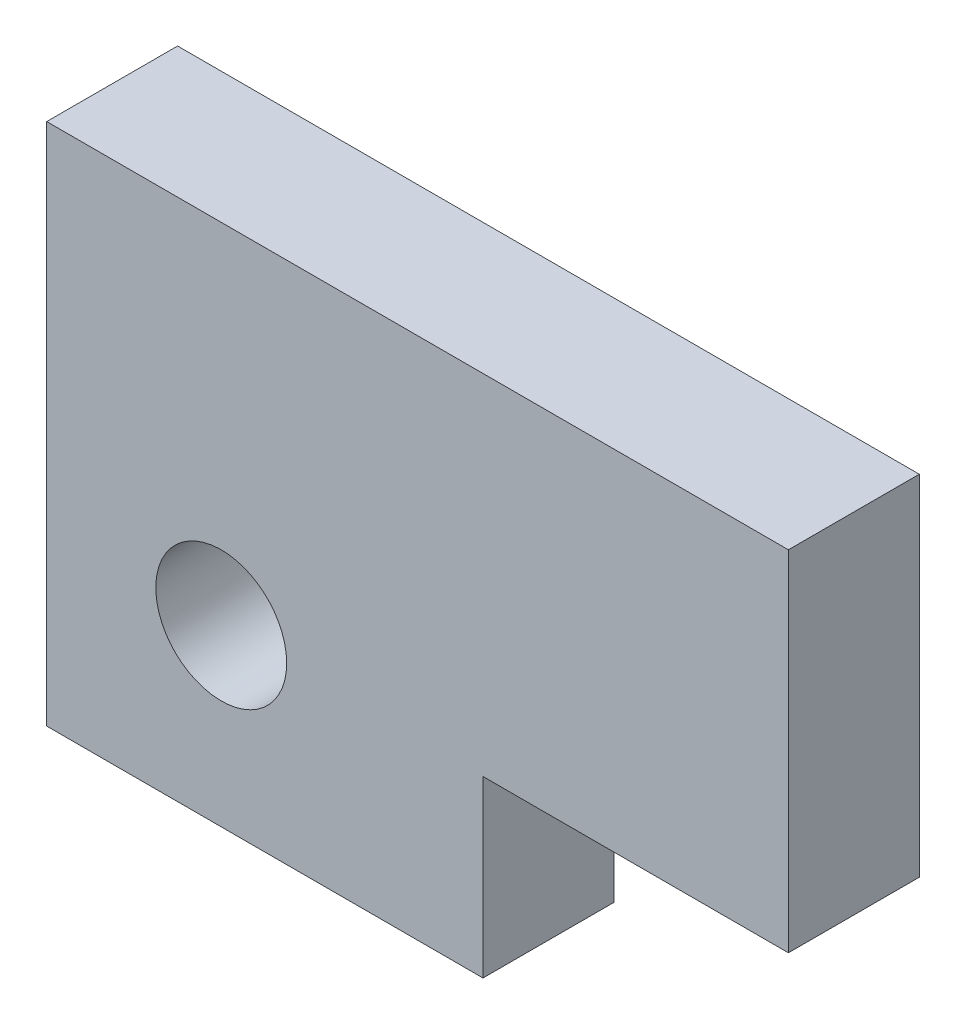
ISO-10303-21;
HEADER;
FILE_DESCRIPTION(('STEP AP214'),'2;1');
FILE_NAME('part.step','',(''),(''),'','','');
FILE_SCHEMA(('AUTOMOTIVE_DESIGN { 1 0 10303 214 1 1 1 1 }'));
ENDSEC;
DATA;
#1=APPLICATION_CONTEXT('core data for automotive mechanical design processes');
#2=APPLICATION_PROTOCOL_DEFINITION('international standard','automotive_design',2000,#1);
#3=PRODUCT_CONTEXT('',#1,'mechanical');
#4=PRODUCT('Part','Part','',(#3));
#5=PRODUCT_RELATED_PRODUCT_CATEGORY('part','',(#4));
#6=PRODUCT_DEFINITION_FORMATION('','',#4);
#7=PRODUCT_DEFINITION_CONTEXT('part definition',#1,'design');
#8=PRODUCT_DEFINITION('design','',#6,#7);
#9=PRODUCT_DEFINITION_SHAPE('','',#8);
#10=(LENGTH_UNIT() NAMED_UNIT(*) SI_UNIT(.MILLI.,.METRE.));
#11=(NAMED_UNIT(*) PLANE_ANGLE_UNIT() SI_UNIT($,.RADIAN.));
#12=(NAMED_UNIT(*) SI_UNIT($,.STERADIAN.) SOLID_ANGLE_UNIT());
#13=UNCERTAINTY_MEASURE_WITH_UNIT(LENGTH_MEASURE(1.E-05),#10,'distance_accuracy_value','');
#14=(GEOMETRIC_REPRESENTATION_CONTEXT(3) GLOBAL_UNCERTAINTY_ASSIGNED_CONTEXT((#13)) GLOBAL_UNIT_ASSIGNED_CONTEXT((#10,
#11,#12)) REPRESENTATION_CONTEXT('',''));
#15=CARTESIAN_POINT('',(0.,0.,0.));
#16=DIRECTION('',(0.,0.,1.));
#17=DIRECTION('',(1.,0.,0.));
#18=AXIS2_PLACEMENT_3D('',#15,#16,#17);
#19=CARTESIAN_POINT('',(0.,0.,3.));
#20=DIRECTION('',(1.,0.,0.));
#21=DIRECTION('',(0.,1.,0.));
#22=AXIS2_PLACEMENT_3D('',#19,#20,#21);
#23=PLANE('',#22);
#24=DIRECTION('',(0.,-1.,0.));
#25=VECTOR('',#24,1.);
#26=CARTESIAN_POINT('',(0.,0.,0.));
#27=LINE('',#26,#25);
#28=CARTESIAN_POINT('',(0.,12.,0.));
#29=VERTEX_POINT('',#28);
#30=CARTESIAN_POINT('',(0.,0.,0.));
#31=VERTEX_POINT('',#30);
#32=EDGE_CURVE('E119',#29,#31,#27,.T.);
#33=ORIENTED_EDGE('',*,*,#32,.T.);
#34=DIRECTION('',(0.,0.,-1.));
#35=VECTOR('',#34,1.);
#36=CARTESIAN_POINT('',(0.,0.,3.));
#37=LINE('',#36,#35);
#38=CARTESIAN_POINT('',(0.,0.,3.));
#39=VERTEX_POINT('',#38);
#40=EDGE_CURVE('E11',#39,#31,#37,.T.);
#41=ORIENTED_EDGE('',*,*,#40,.F.);
#42=DIRECTION('',(0.,-1.,0.));
#43=VECTOR('',#42,1.);
#44=CARTESIAN_POINT('',(0.,0.,3.));
#45=LINE('',#44,#43);
#46=CARTESIAN_POINT('',(0.,12.,3.));
#47=VERTEX_POINT('',#46);
#48=EDGE_CURVE('E130',#47,#39,#45,.T.);
#49=ORIENTED_EDGE('',*,*,#48,.F.);
#50=DIRECTION('',(0.,0.,-1.));
#51=VECTOR('',#50,1.);
#52=CARTESIAN_POINT('',(0.,12.,3.));
#53=LINE('',#52,#51);
#54=EDGE_CURVE('E115',#47,#29,#53,.T.);
#55=ORIENTED_EDGE('',*,*,#54,.T.);
#56=EDGE_LOOP('',(#33,#41,#49,#55));
#57=FACE_BOUND('',#56,.T.);
#58=ADVANCED_FACE('F35',(#57),#23,.F.);
#59=CARTESIAN_POINT('',(0.,0.,3.));
#60=DIRECTION('',(0.,1.,0.));
#61=DIRECTION('',(0.,0.,1.));
#62=AXIS2_PLACEMENT_3D('',#59,#60,#61);
#63=PLANE('',#62);
#64=DIRECTION('',(1.,0.,0.));
#65=VECTOR('',#64,1.);
#66=CARTESIAN_POINT('',(0.,0.,0.));
#67=LINE('',#66,#65);
#68=CARTESIAN_POINT('',(10.,0.,0.));
#69=VERTEX_POINT('',#68);
#70=EDGE_CURVE('E122',#31,#69,#67,.T.);
#71=ORIENTED_EDGE('',*,*,#70,.T.);
#72=DIRECTION('',(0.,0.,-1.));
#73=VECTOR('',#72,1.);
#74=CARTESIAN_POINT('',(10.,0.,3.));
#75=LINE('',#74,#73);
#76=CARTESIAN_POINT('',(10.,0.,3.));
#77=VERTEX_POINT('',#76);
#78=EDGE_CURVE('E43',#77,#69,#75,.T.);
#79=ORIENTED_EDGE('',*,*,#78,.F.);
#80=DIRECTION('',(1.,0.,0.));
#81=VECTOR('',#80,1.);
#82=CARTESIAN_POINT('',(0.,0.,3.));
#83=LINE('',#82,#81);
#84=EDGE_CURVE('E88',#39,#77,#83,.T.);
#85=ORIENTED_EDGE('',*,*,#84,.F.);
#86=ORIENTED_EDGE('',*,*,#40,.T.);
#87=EDGE_LOOP('',(#71,#79,#85,#86));
#88=FACE_BOUND('',#87,.T.);
#89=ADVANCED_FACE('F155',(#88),#63,.F.);
#90=CARTESIAN_POINT('',(10.,4.,3.));
#91=DIRECTION('',(-1.,0.,0.));
#92=DIRECTION('',(0.,-1.,0.));
#93=AXIS2_PLACEMENT_3D('',#90,#91,#92);
#94=PLANE('',#93);
#95=DIRECTION('',(0.,1.,0.));
#96=VECTOR('',#95,1.);
#97=CARTESIAN_POINT('',(10.,4.,0.));
#98=LINE('',#97,#96);
#99=CARTESIAN_POINT('',(10.,4.,0.));
#100=VERTEX_POINT('',#99);
#101=EDGE_CURVE('E125',#69,#100,#98,.T.);
#102=ORIENTED_EDGE('',*,*,#101,.T.);
#103=DIRECTION('',(0.,0.,-1.));
#104=VECTOR('',#103,1.);
#105=CARTESIAN_POINT('',(10.,4.,3.));
#106=LINE('',#105,#104);
#107=CARTESIAN_POINT('',(10.,4.,3.));
#108=VERTEX_POINT('',#107);
#109=EDGE_CURVE('E110',#108,#100,#106,.T.);
#110=ORIENTED_EDGE('',*,*,#109,.F.);
#111=DIRECTION('',(0.,1.,0.));
#112=VECTOR('',#111,1.);
#113=CARTESIAN_POINT('',(10.,4.,3.));
#114=LINE('',#113,#112);
#115=EDGE_CURVE('E101',#77,#108,#114,.T.);
#116=ORIENTED_EDGE('',*,*,#115,.F.);
#117=ORIENTED_EDGE('',*,*,#78,.T.);
#118=EDGE_LOOP('',(#102,#110,#116,#117));
#119=FACE_BOUND('',#118,.T.);
#120=ADVANCED_FACE('F136',(#119),#94,.F.);
#121=CARTESIAN_POINT('',(17.,4.,3.));
#122=DIRECTION('',(0.,1.,0.));
#123=DIRECTION('',(-1.,0.,0.));
#124=AXIS2_PLACEMENT_3D('',#121,#122,#123);
#125=PLANE('',#124);
#126=DIRECTION('',(1.,0.,0.));
#127=VECTOR('',#126,1.);
#128=CARTESIAN_POINT('',(17.,4.,0.));
#129=LINE('',#128,#127);
#130=CARTESIAN_POINT('',(17.,4.,0.));
#131=VERTEX_POINT('',#130);
#132=EDGE_CURVE('E109',#100,#131,#129,.T.);
#133=ORIENTED_EDGE('',*,*,#132,.T.);
#134=DIRECTION('',(0.,0.,-1.));
#135=VECTOR('',#134,1.);
#136=CARTESIAN_POINT('',(17.,4.,3.));
#137=LINE('',#136,#135);
#138=CARTESIAN_POINT('',(17.,4.,3.));
#139=VERTEX_POINT('',#138);
#140=EDGE_CURVE('E106',#139,#131,#137,.T.);
#141=ORIENTED_EDGE('',*,*,#140,.F.);
#142=DIRECTION('',(1.,0.,0.));
#143=VECTOR('',#142,1.);
#144=CARTESIAN_POINT('',(17.,4.,3.));
#145=LINE('',#144,#143);
#146=EDGE_CURVE('E95',#108,#139,#145,.T.);
#147=ORIENTED_EDGE('',*,*,#146,.F.);
#148=ORIENTED_EDGE('',*,*,#109,.T.);
#149=EDGE_LOOP('',(#133,#141,#147,#148));
#150=FACE_BOUND('',#149,.T.);
#151=ADVANCED_FACE('F107',(#150),#125,.F.);
#152=CARTESIAN_POINT('',(17.,4.,3.));
#153=DIRECTION('',(-1.,0.,0.));
#154=DIRECTION('',(0.,0.,1.));
#155=AXIS2_PLACEMENT_3D('',#152,#153,#154);
#156=PLANE('',#155);
#157=DIRECTION('',(0.,1.,0.));
#158=VECTOR('',#157,1.);
#159=CARTESIAN_POINT('',(17.,4.,0.));
#160=LINE('',#159,#158);
#161=CARTESIAN_POINT('',(17.,12.,0.));
#162=VERTEX_POINT('',#161);
#163=EDGE_CURVE('E74',#131,#162,#160,.T.);
#164=ORIENTED_EDGE('',*,*,#163,.T.);
#165=DIRECTION('',(0.,0.,-1.));
#166=VECTOR('',#165,1.);
#167=CARTESIAN_POINT('',(17.,12.,3.));
#168=LINE('',#167,#166);
#169=CARTESIAN_POINT('',(17.,12.,3.));
#170=VERTEX_POINT('',#169);
#171=EDGE_CURVE('E111',#170,#162,#168,.T.);
#172=ORIENTED_EDGE('',*,*,#171,.F.);
#173=DIRECTION('',(0.,1.,0.));
#174=VECTOR('',#173,1.);
#175=CARTESIAN_POINT('',(17.,4.,3.));
#176=LINE('',#175,#174);
#177=EDGE_CURVE('E99',#139,#170,#176,.T.);
#178=ORIENTED_EDGE('',*,*,#177,.F.);
#179=ORIENTED_EDGE('',*,*,#140,.T.);
#180=EDGE_LOOP('',(#164,#172,#178,#179));
#181=FACE_BOUND('',#180,.T.);
#182=ADVANCED_FACE('F113',(#181),#156,.F.);
#183=CARTESIAN_POINT('',(0.,12.,3.));
#184=DIRECTION('',(0.,-1.,0.));
#185=DIRECTION('',(0.,0.,-1.));
#186=AXIS2_PLACEMENT_3D('',#183,#184,#185);
#187=PLANE('',#186);
#188=DIRECTION('',(-1.,0.,0.));
#189=VECTOR('',#188,1.);
#190=CARTESIAN_POINT('',(0.,12.,0.));
#191=LINE('',#190,#189);
#192=EDGE_CURVE('E80',#162,#29,#191,.T.);
#193=ORIENTED_EDGE('',*,*,#192,.T.);
#194=ORIENTED_EDGE('',*,*,#54,.F.);
#195=DIRECTION('',(-1.,0.,0.));
#196=VECTOR('',#195,1.);
#197=CARTESIAN_POINT('',(0.,12.,3.));
#198=LINE('',#197,#196);
#199=EDGE_CURVE('E51',#170,#47,#198,.T.);
#200=ORIENTED_EDGE('',*,*,#199,.F.);
#201=ORIENTED_EDGE('',*,*,#171,.T.);
#202=EDGE_LOOP('',(#193,#194,#200,#201));
#203=FACE_BOUND('',#202,.T.);
#204=ADVANCED_FACE('F143',(#203),#187,.F.);
#205=CARTESIAN_POINT('',(0.,0.,3.));
#206=DIRECTION('',(0.,0.,-1.));
#207=DIRECTION('',(-1.,0.,0.));
#208=AXIS2_PLACEMENT_3D('',#205,#206,#207);
#209=PLANE('',#208);
#210=CARTESIAN_POINT('',(4.,4.,3.));
#211=DIRECTION('',(0.,0.,1.));
#212=DIRECTION('',(1.,0.,0.));
#213=AXIS2_PLACEMENT_3D('',#210,#211,#212);
#214=CIRCLE('',#213,1.5);
#215=CARTESIAN_POINT('',(5.5,4.,3.));
#216=VERTEX_POINT('',#215);
#217=EDGE_CURVE('E210',#216,#216,#214,.T.);
#218=ORIENTED_EDGE('',*,*,#217,.F.);
#219=EDGE_LOOP('',(#218));
#220=FACE_BOUND('',#219,.T.);
#221=ORIENTED_EDGE('',*,*,#48,.T.);
#222=ORIENTED_EDGE('',*,*,#84,.T.);
#223=ORIENTED_EDGE('',*,*,#115,.T.);
#224=ORIENTED_EDGE('',*,*,#146,.T.);
#225=ORIENTED_EDGE('',*,*,#177,.T.);
#226=ORIENTED_EDGE('',*,*,#199,.T.);
#227=EDGE_LOOP('',(#221,#222,#223,#224,#225,#226));
#228=FACE_BOUND('',#227,.T.);
#229=ADVANCED_FACE('F97',(#220,#228),#209,.F.);
#230=CARTESIAN_POINT('',(0.,0.,0.));
#231=DIRECTION('',(0.,0.,-1.));
#232=DIRECTION('',(-1.,0.,0.));
#233=AXIS2_PLACEMENT_3D('',#230,#231,#232);
#234=PLANE('',#233);
#235=CARTESIAN_POINT('',(4.,4.,0.));
#236=DIRECTION('',(0.,0.,1.));
#237=DIRECTION('',(1.,0.,0.));
#238=AXIS2_PLACEMENT_3D('',#235,#236,#237);
#239=CIRCLE('',#238,1.5);
#240=CARTESIAN_POINT('',(5.5,4.,0.));
#241=VERTEX_POINT('',#240);
#242=EDGE_CURVE('E123',#241,#241,#239,.T.);
#243=ORIENTED_EDGE('',*,*,#242,.T.);
#244=EDGE_LOOP('',(#243));
#245=FACE_BOUND('',#244,.T.);
#246=ORIENTED_EDGE('',*,*,#32,.F.);
#247=ORIENTED_EDGE('',*,*,#192,.F.);
#248=ORIENTED_EDGE('',*,*,#163,.F.);
#249=ORIENTED_EDGE('',*,*,#132,.F.);
#250=ORIENTED_EDGE('',*,*,#101,.F.);
#251=ORIENTED_EDGE('',*,*,#70,.F.);
#252=EDGE_LOOP('',(#246,#247,#248,#249,#250,#251));
#253=FACE_BOUND('',#252,.T.);
#254=ADVANCED_FACE('F139',(#245,#253),#234,.T.);
#255=CARTESIAN_POINT('',(4.,4.,0.));
#256=DIRECTION('',(0.,0.,1.));
#257=DIRECTION('',(1.,0.,0.));
#258=AXIS2_PLACEMENT_3D('',#255,#256,#257);
#259=CYLINDRICAL_SURFACE('',#258,1.5);
#260=ORIENTED_EDGE('',*,*,#242,.F.);
#261=EDGE_LOOP('',(#260));
#262=FACE_BOUND('',#261,.T.);
#263=ORIENTED_EDGE('',*,*,#217,.T.);
#264=EDGE_LOOP('',(#263));
#265=FACE_BOUND('',#264,.T.);
#266=ADVANCED_FACE('F192',(#262,#265),#259,.F.);
#267=CLOSED_SHELL('',(#58,#89,#120,#151,#182,#204,#229,#254,#266));
#268=MANIFOLD_SOLID_BREP('B2',#267);
#269=ADVANCED_BREP_SHAPE_REPRESENTATION('',(#18,#268),#14);
#270=SHAPE_DEFINITION_REPRESENTATION(#9,#269);
ENDSEC;
END-ISO-10303-21;
